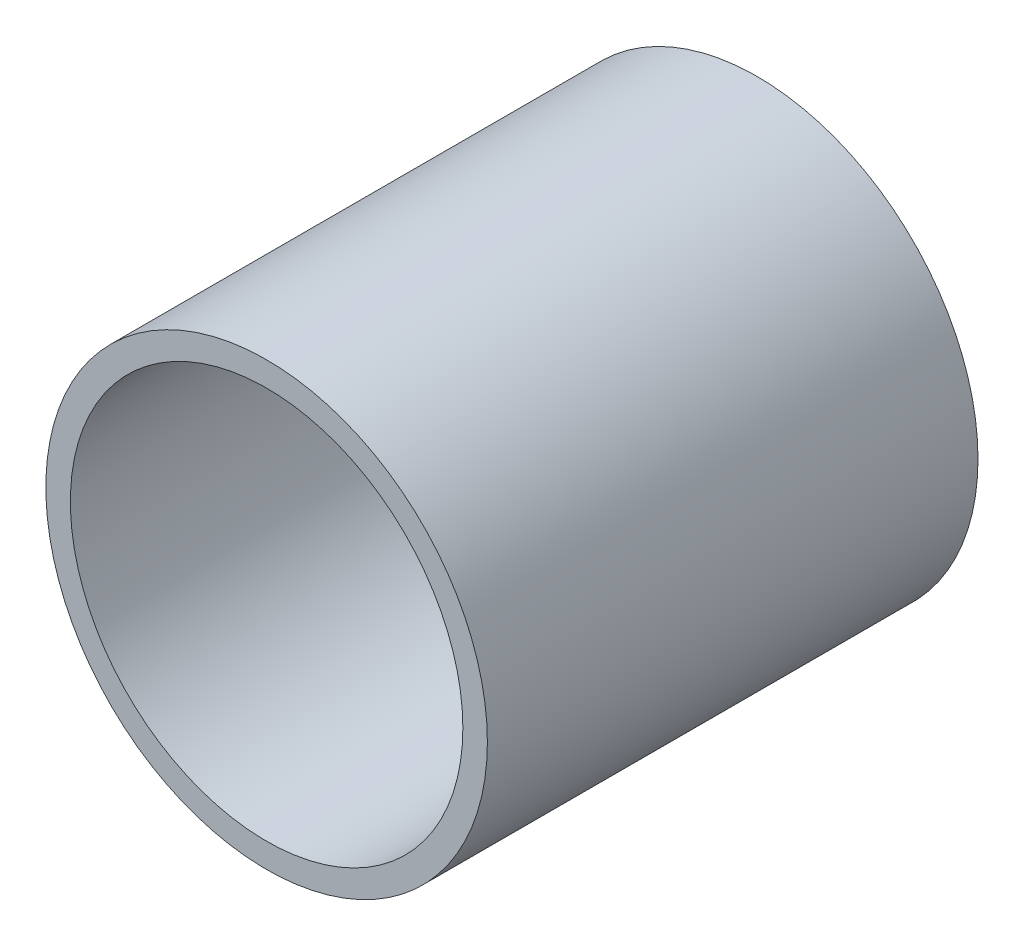
ISO-10303-21;
HEADER;
FILE_DESCRIPTION(('STEP AP214'),'2;1');
FILE_NAME('part.step','',(''),(''),'','','');
FILE_SCHEMA(('AUTOMOTIVE_DESIGN { 1 0 10303 214 1 1 1 1 }'));
ENDSEC;
DATA;
#1=APPLICATION_CONTEXT('core data for automotive mechanical design processes');
#2=APPLICATION_PROTOCOL_DEFINITION('international standard','automotive_design',2000,#1);
#3=PRODUCT_CONTEXT('',#1,'mechanical');
#4=PRODUCT('Part','Part','',(#3));
#5=PRODUCT_RELATED_PRODUCT_CATEGORY('part','',(#4));
#6=PRODUCT_DEFINITION_FORMATION('','',#4);
#7=PRODUCT_DEFINITION_CONTEXT('part definition',#1,'design');
#8=PRODUCT_DEFINITION('design','',#6,#7);
#9=PRODUCT_DEFINITION_SHAPE('','',#8);
#10=(LENGTH_UNIT() NAMED_UNIT(*) SI_UNIT(.MILLI.,.METRE.));
#11=(NAMED_UNIT(*) PLANE_ANGLE_UNIT() SI_UNIT($,.RADIAN.));
#12=(NAMED_UNIT(*) SI_UNIT($,.STERADIAN.) SOLID_ANGLE_UNIT());
#13=UNCERTAINTY_MEASURE_WITH_UNIT(LENGTH_MEASURE(1.E-05),#10,'distance_accuracy_value','');
#14=(GEOMETRIC_REPRESENTATION_CONTEXT(3) GLOBAL_UNCERTAINTY_ASSIGNED_CONTEXT((#13)) GLOBAL_UNIT_ASSIGNED_CONTEXT((#10,
#11,#12)) REPRESENTATION_CONTEXT('',''));
#15=CARTESIAN_POINT('',(0.,0.,0.));
#16=DIRECTION('',(0.,0.,1.));
#17=DIRECTION('',(1.,0.,0.));
#18=AXIS2_PLACEMENT_3D('',#15,#16,#17);
#19=CARTESIAN_POINT('',(0.,0.,127.));
#20=DIRECTION('',(0.,0.,1.));
#21=DIRECTION('',(1.,0.,0.));
#22=AXIS2_PLACEMENT_3D('',#19,#20,#21);
#23=PLANE('',#22);
#24=CARTESIAN_POINT('',(0.,0.,127.));
#25=DIRECTION('',(0.,0.,1.));
#26=DIRECTION('',(1.,0.,0.));
#27=AXIS2_PLACEMENT_3D('',#24,#25,#26);
#28=CIRCLE('',#27,57.15);
#29=CARTESIAN_POINT('',(57.15,0.,127.));
#30=VERTEX_POINT('',#29);
#31=EDGE_CURVE('E13',#30,#30,#28,.T.);
#32=ORIENTED_EDGE('',*,*,#31,.T.);
#33=EDGE_LOOP('',(#32));
#34=FACE_BOUND('',#33,.T.);
#35=CARTESIAN_POINT('',(0.,0.,127.));
#36=DIRECTION('',(0.,0.,1.));
#37=DIRECTION('',(1.,0.,0.));
#38=AXIS2_PLACEMENT_3D('',#35,#36,#37);
#39=CIRCLE('',#38,50.8);
#40=CARTESIAN_POINT('',(50.8,0.,127.));
#41=VERTEX_POINT('',#40);
#42=EDGE_CURVE('E57',#41,#41,#39,.T.);
#43=ORIENTED_EDGE('',*,*,#42,.F.);
#44=EDGE_LOOP('',(#43));
#45=FACE_BOUND('',#44,.T.);
#46=ADVANCED_FACE('F46',(#34,#45),#23,.T.);
#47=CARTESIAN_POINT('',(0.,0.,0.));
#48=DIRECTION('',(0.,0.,1.));
#49=DIRECTION('',(1.,0.,0.));
#50=AXIS2_PLACEMENT_3D('',#47,#48,#49);
#51=PLANE('',#50);
#52=CARTESIAN_POINT('',(0.,0.,0.));
#53=DIRECTION('',(0.,0.,1.));
#54=DIRECTION('',(1.,0.,0.));
#55=AXIS2_PLACEMENT_3D('',#52,#53,#54);
#56=CIRCLE('',#55,57.15);
#57=CARTESIAN_POINT('',(57.15,0.,0.));
#58=VERTEX_POINT('',#57);
#59=EDGE_CURVE('E50',#58,#58,#56,.T.);
#60=ORIENTED_EDGE('',*,*,#59,.F.);
#61=EDGE_LOOP('',(#60));
#62=FACE_BOUND('',#61,.T.);
#63=CARTESIAN_POINT('',(0.,0.,0.));
#64=DIRECTION('',(0.,0.,1.));
#65=DIRECTION('',(1.,0.,0.));
#66=AXIS2_PLACEMENT_3D('',#63,#64,#65);
#67=CIRCLE('',#66,50.8);
#68=CARTESIAN_POINT('',(50.8,0.,0.));
#69=VERTEX_POINT('',#68);
#70=EDGE_CURVE('E59',#69,#69,#67,.T.);
#71=ORIENTED_EDGE('',*,*,#70,.T.);
#72=EDGE_LOOP('',(#71));
#73=FACE_BOUND('',#72,.T.);
#74=ADVANCED_FACE('F69',(#62,#73),#51,.F.);
#75=CARTESIAN_POINT('',(0.,0.,127.));
#76=DIRECTION('',(0.,0.,-1.));
#77=DIRECTION('',(-1.,0.,0.));
#78=AXIS2_PLACEMENT_3D('',#75,#76,#77);
#79=CYLINDRICAL_SURFACE('',#78,57.15);
#80=ORIENTED_EDGE('',*,*,#31,.F.);
#81=EDGE_LOOP('',(#80));
#82=FACE_BOUND('',#81,.T.);
#83=ORIENTED_EDGE('',*,*,#59,.T.);
#84=EDGE_LOOP('',(#83));
#85=FACE_BOUND('',#84,.T.);
#86=ADVANCED_FACE('F48',(#82,#85),#79,.T.);
#87=CARTESIAN_POINT('',(0.,0.,127.));
#88=DIRECTION('',(0.,0.,-1.));
#89=DIRECTION('',(-1.,0.,0.));
#90=AXIS2_PLACEMENT_3D('',#87,#88,#89);
#91=CYLINDRICAL_SURFACE('',#90,50.8);
#92=ORIENTED_EDGE('',*,*,#42,.T.);
#93=EDGE_LOOP('',(#92));
#94=FACE_BOUND('',#93,.T.);
#95=ORIENTED_EDGE('',*,*,#70,.F.);
#96=EDGE_LOOP('',(#95));
#97=FACE_BOUND('',#96,.T.);
#98=ADVANCED_FACE('F65',(#94,#97),#91,.F.);
#99=CLOSED_SHELL('',(#46,#74,#86,#98));
#100=MANIFOLD_SOLID_BREP('B2',#99);
#101=ADVANCED_BREP_SHAPE_REPRESENTATION('',(#18,#100),#14);
#102=SHAPE_DEFINITION_REPRESENTATION(#9,#101);
ENDSEC;
END-ISO-10303-21;
